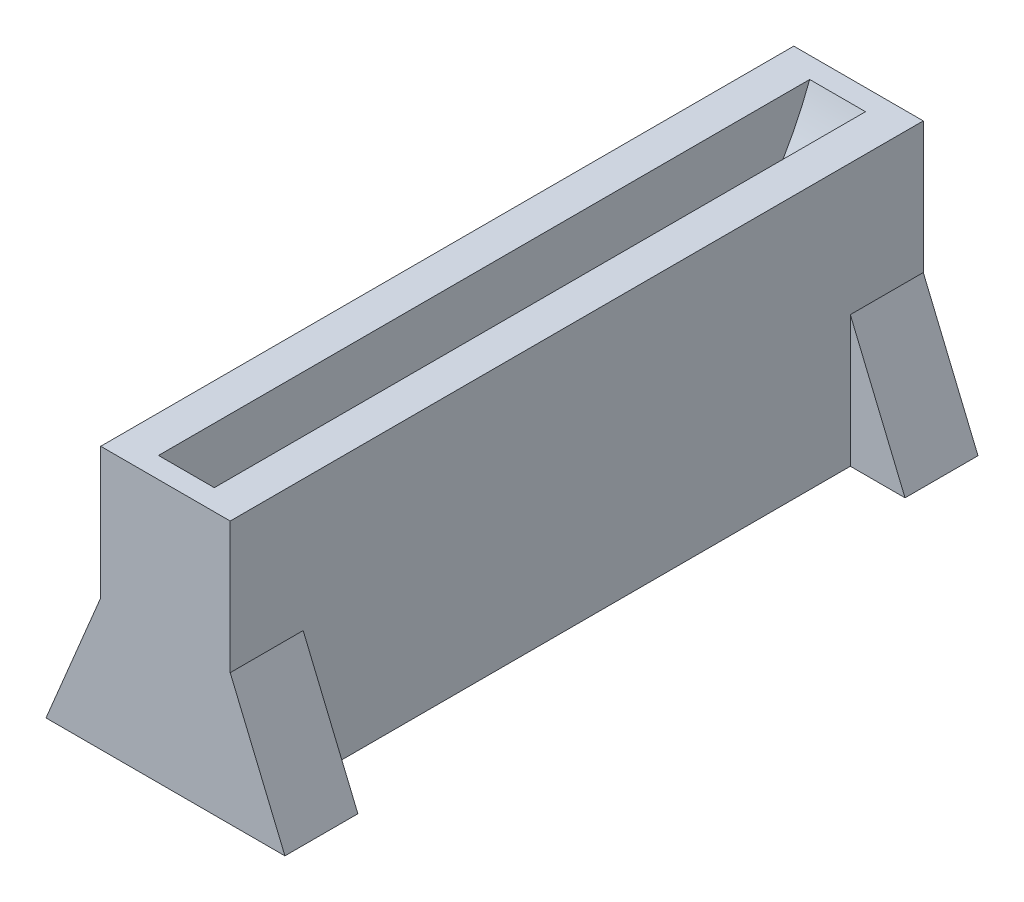
ISO-10303-21;
HEADER;
FILE_DESCRIPTION(('STEP AP214'),'2;1');
FILE_NAME('part.step','',(''),(''),'','','');
FILE_SCHEMA(('AUTOMOTIVE_DESIGN { 1 0 10303 214 1 1 1 1 }'));
ENDSEC;
DATA;
#1=APPLICATION_CONTEXT('core data for automotive mechanical design processes');
#2=APPLICATION_PROTOCOL_DEFINITION('international standard','automotive_design',2000,#1);
#3=PRODUCT_CONTEXT('',#1,'mechanical');
#4=PRODUCT('Part','Part','',(#3));
#5=PRODUCT_RELATED_PRODUCT_CATEGORY('part','',(#4));
#6=PRODUCT_DEFINITION_FORMATION('','',#4);
#7=PRODUCT_DEFINITION_CONTEXT('part definition',#1,'design');
#8=PRODUCT_DEFINITION('design','',#6,#7);
#9=PRODUCT_DEFINITION_SHAPE('','',#8);
#10=(LENGTH_UNIT() NAMED_UNIT(*) SI_UNIT(.MILLI.,.METRE.));
#11=(NAMED_UNIT(*) PLANE_ANGLE_UNIT() SI_UNIT($,.RADIAN.));
#12=(NAMED_UNIT(*) SI_UNIT($,.STERADIAN.) SOLID_ANGLE_UNIT());
#13=UNCERTAINTY_MEASURE_WITH_UNIT(LENGTH_MEASURE(1.E-05),#10,'distance_accuracy_value','');
#14=(GEOMETRIC_REPRESENTATION_CONTEXT(3) GLOBAL_UNCERTAINTY_ASSIGNED_CONTEXT((#13)) GLOBAL_UNIT_ASSIGNED_CONTEXT((#10,
#11,#12)) REPRESENTATION_CONTEXT('',''));
#15=CARTESIAN_POINT('',(0.,0.,0.));
#16=DIRECTION('',(0.,0.,1.));
#17=DIRECTION('',(1.,0.,0.));
#18=AXIS2_PLACEMENT_3D('',#15,#16,#17);
#19=CARTESIAN_POINT('',(0.,0.,0.));
#20=DIRECTION('',(0.,1.,0.));
#21=DIRECTION('',(0.,0.,1.));
#22=AXIS2_PLACEMENT_3D('',#19,#20,#21);
#23=PLANE('',#22);
#24=DIRECTION('',(-1.,0.,0.));
#25=VECTOR('',#24,1.);
#26=CARTESIAN_POINT('',(90.3346548091003,0.,-75.));
#27=LINE('',#26,#25);
#28=CARTESIAN_POINT('',(32.75,0.,-75.));
#29=VERTEX_POINT('',#28);
#30=CARTESIAN_POINT('',(17.75,0.,-75.));
#31=VERTEX_POINT('',#30);
#32=EDGE_CURVE('E144',#29,#31,#27,.T.);
#33=ORIENTED_EDGE('',*,*,#32,.T.);
#34=DIRECTION('',(0.,0.,1.));
#35=VECTOR('',#34,1.);
#36=CARTESIAN_POINT('',(17.75,0.,-75.));
#37=LINE('',#36,#35);
#38=CARTESIAN_POINT('',(17.75,0.,75.));
#39=VERTEX_POINT('',#38);
#40=EDGE_CURVE('E151',#31,#39,#37,.T.);
#41=ORIENTED_EDGE('',*,*,#40,.T.);
#42=DIRECTION('',(1.,0.,0.));
#43=VECTOR('',#42,1.);
#44=CARTESIAN_POINT('',(17.75,0.,75.));
#45=LINE('',#44,#43);
#46=CARTESIAN_POINT('',(32.75,0.,75.));
#47=VERTEX_POINT('',#46);
#48=EDGE_CURVE('E156',#39,#47,#45,.T.);
#49=ORIENTED_EDGE('',*,*,#48,.T.);
#50=DIRECTION('',(0.,0.,1.));
#51=VECTOR('',#50,1.);
#52=CARTESIAN_POINT('',(32.75,0.,-95.));
#53=LINE('',#52,#51);
#54=CARTESIAN_POINT('',(32.75,0.,95.));
#55=VERTEX_POINT('',#54);
#56=EDGE_CURVE('E192',#47,#55,#53,.T.);
#57=ORIENTED_EDGE('',*,*,#56,.T.);
#58=DIRECTION('',(1.,0.,0.));
#59=VECTOR('',#58,1.);
#60=CARTESIAN_POINT('',(-17.75,0.,95.));
#61=LINE('',#60,#59);
#62=CARTESIAN_POINT('',(-32.75,0.,95.));
#63=VERTEX_POINT('',#62);
#64=EDGE_CURVE('E230',#63,#55,#61,.T.);
#65=ORIENTED_EDGE('',*,*,#64,.F.);
#66=DIRECTION('',(0.,0.,1.));
#67=VECTOR('',#66,1.);
#68=CARTESIAN_POINT('',(-32.75,0.,-95.));
#69=LINE('',#68,#67);
#70=CARTESIAN_POINT('',(-32.75,0.,75.));
#71=VERTEX_POINT('',#70);
#72=EDGE_CURVE('E213',#71,#63,#69,.T.);
#73=ORIENTED_EDGE('',*,*,#72,.F.);
#74=DIRECTION('',(1.,0.,0.));
#75=VECTOR('',#74,1.);
#76=CARTESIAN_POINT('',(-59.1200336801783,0.,75.));
#77=LINE('',#76,#75);
#78=CARTESIAN_POINT('',(-17.75,0.,75.));
#79=VERTEX_POINT('',#78);
#80=EDGE_CURVE('E171',#71,#79,#77,.T.);
#81=ORIENTED_EDGE('',*,*,#80,.T.);
#82=DIRECTION('',(0.,0.,-1.));
#83=VECTOR('',#82,1.);
#84=CARTESIAN_POINT('',(-17.75,0.,75.));
#85=LINE('',#84,#83);
#86=CARTESIAN_POINT('',(-17.75,0.,-75.));
#87=VERTEX_POINT('',#86);
#88=EDGE_CURVE('E175',#79,#87,#85,.T.);
#89=ORIENTED_EDGE('',*,*,#88,.T.);
#90=DIRECTION('',(-1.,0.,0.));
#91=VECTOR('',#90,1.);
#92=CARTESIAN_POINT('',(-17.75,0.,-75.));
#93=LINE('',#92,#91);
#94=CARTESIAN_POINT('',(-32.75,0.,-75.));
#95=VERTEX_POINT('',#94);
#96=EDGE_CURVE('E148',#87,#95,#93,.T.);
#97=ORIENTED_EDGE('',*,*,#96,.T.);
#98=CARTESIAN_POINT('',(-32.75,0.,-95.));
#99=VERTEX_POINT('',#98);
#100=EDGE_CURVE('E208',#99,#95,#69,.T.);
#101=ORIENTED_EDGE('',*,*,#100,.F.);
#102=DIRECTION('',(-1.,0.,0.));
#103=VECTOR('',#102,1.);
#104=CARTESIAN_POINT('',(-17.75,0.,-95.));
#105=LINE('',#104,#103);
#106=CARTESIAN_POINT('',(32.75,0.,-95.));
#107=VERTEX_POINT('',#106);
#108=EDGE_CURVE('E224',#107,#99,#105,.T.);
#109=ORIENTED_EDGE('',*,*,#108,.F.);
#110=EDGE_CURVE('E160',#107,#29,#53,.T.);
#111=ORIENTED_EDGE('',*,*,#110,.T.);
#112=EDGE_LOOP('',(#33,#41,#49,#57,#65,#73,#81,#89,#97,#101,#109,#111));
#113=FACE_BOUND('',#112,.T.);
#114=ADVANCED_FACE('F39',(#113),#23,.F.);
#115=CARTESIAN_POINT('',(32.75,0.,-95.));
#116=DIRECTION('',(0.923076923076923,0.384615384615385,0.));
#117=DIRECTION('',(-0.384615384615385,0.923076923076923,0.));
#118=AXIS2_PLACEMENT_3D('',#115,#116,#117);
#119=PLANE('',#118);
#120=DIRECTION('',(0.,0.,1.));
#121=VECTOR('',#120,1.);
#122=CARTESIAN_POINT('',(17.75,36.,-95.));
#123=LINE('',#122,#121);
#124=CARTESIAN_POINT('',(17.75,36.,-95.));
#125=VERTEX_POINT('',#124);
#126=CARTESIAN_POINT('',(17.75,36.,-75.));
#127=VERTEX_POINT('',#126);
#128=EDGE_CURVE('E193',#125,#127,#123,.T.);
#129=ORIENTED_EDGE('',*,*,#128,.T.);
#130=DIRECTION('',(0.384615384615385,-0.923076923076923,0.));
#131=VECTOR('',#130,1.);
#132=CARTESIAN_POINT('',(32.75,0.,-75.));
#133=LINE('',#132,#131);
#134=EDGE_CURVE('E11',#127,#29,#133,.T.);
#135=ORIENTED_EDGE('',*,*,#134,.T.);
#136=ORIENTED_EDGE('',*,*,#110,.F.);
#137=DIRECTION('',(-0.384615384615385,0.923076923076923,0.));
#138=VECTOR('',#137,1.);
#139=CARTESIAN_POINT('',(32.75,0.,-95.));
#140=LINE('',#139,#138);
#141=EDGE_CURVE('E188',#107,#125,#140,.T.);
#142=ORIENTED_EDGE('',*,*,#141,.T.);
#143=EDGE_LOOP('',(#129,#135,#136,#142));
#144=FACE_BOUND('',#143,.T.);
#145=ADVANCED_FACE('F331',(#144),#119,.T.);
#146=ORIENTED_EDGE('',*,*,#56,.F.);
#147=DIRECTION('',(-0.384615384615385,0.923076923076923,0.));
#148=VECTOR('',#147,1.);
#149=CARTESIAN_POINT('',(32.75,0.,75.));
#150=LINE('',#149,#148);
#151=CARTESIAN_POINT('',(17.75,36.,75.));
#152=VERTEX_POINT('',#151);
#153=EDGE_CURVE('E48',#47,#152,#150,.T.);
#154=ORIENTED_EDGE('',*,*,#153,.T.);
#155=CARTESIAN_POINT('',(17.75,36.,95.));
#156=VERTEX_POINT('',#155);
#157=EDGE_CURVE('E197',#152,#156,#123,.T.);
#158=ORIENTED_EDGE('',*,*,#157,.T.);
#159=DIRECTION('',(-0.384615384615385,0.923076923076923,0.));
#160=VECTOR('',#159,1.);
#161=CARTESIAN_POINT('',(32.75,0.,95.));
#162=LINE('',#161,#160);
#163=EDGE_CURVE('E184',#55,#156,#162,.T.);
#164=ORIENTED_EDGE('',*,*,#163,.F.);
#165=EDGE_LOOP('',(#146,#154,#158,#164));
#166=FACE_BOUND('',#165,.T.);
#167=ADVANCED_FACE('F285',(#166),#119,.T.);
#168=CARTESIAN_POINT('',(-32.75,0.,-95.));
#169=DIRECTION('',(-0.923076923076923,0.384615384615385,0.));
#170=DIRECTION('',(-0.384615384615385,-0.923076923076923,0.));
#171=AXIS2_PLACEMENT_3D('',#168,#169,#170);
#172=PLANE('',#171);
#173=ORIENTED_EDGE('',*,*,#100,.T.);
#174=DIRECTION('',(0.384615384615385,0.923076923076923,0.));
#175=VECTOR('',#174,1.);
#176=CARTESIAN_POINT('',(-32.75,0.,-75.));
#177=LINE('',#176,#175);
#178=CARTESIAN_POINT('',(-17.75,36.,-75.));
#179=VERTEX_POINT('',#178);
#180=EDGE_CURVE('E279',#95,#179,#177,.T.);
#181=ORIENTED_EDGE('',*,*,#180,.T.);
#182=DIRECTION('',(0.,0.,1.));
#183=VECTOR('',#182,1.);
#184=CARTESIAN_POINT('',(-17.75,36.,-95.));
#185=LINE('',#184,#183);
#186=CARTESIAN_POINT('',(-17.75,36.,-95.));
#187=VERTEX_POINT('',#186);
#188=EDGE_CURVE('E214',#187,#179,#185,.T.);
#189=ORIENTED_EDGE('',*,*,#188,.F.);
#190=DIRECTION('',(-0.384615384615385,-0.923076923076923,0.));
#191=VECTOR('',#190,1.);
#192=CARTESIAN_POINT('',(-32.75,0.,-95.));
#193=LINE('',#192,#191);
#194=EDGE_CURVE('E203',#187,#99,#193,.T.);
#195=ORIENTED_EDGE('',*,*,#194,.T.);
#196=EDGE_LOOP('',(#173,#181,#189,#195));
#197=FACE_BOUND('',#196,.T.);
#198=ADVANCED_FACE('F314',(#197),#172,.T.);
#199=CARTESIAN_POINT('',(-17.75,36.,75.));
#200=VERTEX_POINT('',#199);
#201=CARTESIAN_POINT('',(-17.75,36.,95.));
#202=VERTEX_POINT('',#201);
#203=EDGE_CURVE('E207',#200,#202,#185,.T.);
#204=ORIENTED_EDGE('',*,*,#203,.F.);
#205=DIRECTION('',(-0.384615384615385,-0.923076923076923,0.));
#206=VECTOR('',#205,1.);
#207=CARTESIAN_POINT('',(-32.75,0.,75.));
#208=LINE('',#207,#206);
#209=EDGE_CURVE('E275',#200,#71,#208,.T.);
#210=ORIENTED_EDGE('',*,*,#209,.T.);
#211=ORIENTED_EDGE('',*,*,#72,.T.);
#212=DIRECTION('',(-0.384615384615385,-0.923076923076923,0.));
#213=VECTOR('',#212,1.);
#214=CARTESIAN_POINT('',(-32.75,0.,95.));
#215=LINE('',#214,#213);
#216=EDGE_CURVE('E196',#202,#63,#215,.T.);
#217=ORIENTED_EDGE('',*,*,#216,.F.);
#218=EDGE_LOOP('',(#204,#210,#211,#217));
#219=FACE_BOUND('',#218,.T.);
#220=ADVANCED_FACE('F300',(#219),#172,.T.);
#221=CARTESIAN_POINT('',(17.75,72.,-95.));
#222=DIRECTION('',(-1.,0.,0.));
#223=DIRECTION('',(0.,0.,1.));
#224=AXIS2_PLACEMENT_3D('',#221,#222,#223);
#225=PLANE('',#224);
#226=ORIENTED_EDGE('',*,*,#157,.F.);
#227=DIRECTION('',(0.,-1.,0.));
#228=VECTOR('',#227,1.);
#229=CARTESIAN_POINT('',(17.75,45.,75.));
#230=LINE('',#229,#228);
#231=EDGE_CURVE('E55',#152,#39,#230,.T.);
#232=ORIENTED_EDGE('',*,*,#231,.T.);
#233=ORIENTED_EDGE('',*,*,#40,.F.);
#234=DIRECTION('',(0.,-1.,0.));
#235=VECTOR('',#234,1.);
#236=CARTESIAN_POINT('',(17.75,45.,-75.));
#237=LINE('',#236,#235);
#238=EDGE_CURVE('E140',#127,#31,#237,.T.);
#239=ORIENTED_EDGE('',*,*,#238,.F.);
#240=ORIENTED_EDGE('',*,*,#128,.F.);
#241=DIRECTION('',(0.,-1.,0.));
#242=VECTOR('',#241,1.);
#243=CARTESIAN_POINT('',(17.75,72.,-95.));
#244=LINE('',#243,#242);
#245=CARTESIAN_POINT('',(17.75,72.,-95.));
#246=VERTEX_POINT('',#245);
#247=EDGE_CURVE('E256',#246,#125,#244,.T.);
#248=ORIENTED_EDGE('',*,*,#247,.F.);
#249=DIRECTION('',(0.,0.,-1.));
#250=VECTOR('',#249,1.);
#251=CARTESIAN_POINT('',(17.75,72.,-95.));
#252=LINE('',#251,#250);
#253=CARTESIAN_POINT('',(17.75,72.,95.));
#254=VERTEX_POINT('',#253);
#255=EDGE_CURVE('E225',#254,#246,#252,.T.);
#256=ORIENTED_EDGE('',*,*,#255,.F.);
#257=DIRECTION('',(0.,-1.,0.));
#258=VECTOR('',#257,1.);
#259=CARTESIAN_POINT('',(17.75,72.,95.));
#260=LINE('',#259,#258);
#261=EDGE_CURVE('E239',#254,#156,#260,.T.);
#262=ORIENTED_EDGE('',*,*,#261,.T.);
#263=EDGE_LOOP('',(#226,#232,#233,#239,#240,#248,#256,#262));
#264=FACE_BOUND('',#263,.T.);
#265=ADVANCED_FACE('F41',(#264),#225,.F.);
#266=CARTESIAN_POINT('',(-17.75,72.,-95.));
#267=DIRECTION('',(0.,0.,1.));
#268=DIRECTION('',(1.,0.,0.));
#269=AXIS2_PLACEMENT_3D('',#266,#267,#268);
#270=PLANE('',#269);
#271=ORIENTED_EDGE('',*,*,#108,.T.);
#272=ORIENTED_EDGE('',*,*,#194,.F.);
#273=DIRECTION('',(0.,-1.,0.));
#274=VECTOR('',#273,1.);
#275=CARTESIAN_POINT('',(-17.75,72.,-95.));
#276=LINE('',#275,#274);
#277=CARTESIAN_POINT('',(-17.75,72.,-95.));
#278=VERTEX_POINT('',#277);
#279=EDGE_CURVE('E252',#278,#187,#276,.T.);
#280=ORIENTED_EDGE('',*,*,#279,.F.);
#281=DIRECTION('',(-1.,0.,0.));
#282=VECTOR('',#281,1.);
#283=CARTESIAN_POINT('',(-17.75,72.,-95.));
#284=LINE('',#283,#282);
#285=EDGE_CURVE('E229',#246,#278,#284,.T.);
#286=ORIENTED_EDGE('',*,*,#285,.F.);
#287=ORIENTED_EDGE('',*,*,#247,.T.);
#288=ORIENTED_EDGE('',*,*,#141,.F.);
#289=EDGE_LOOP('',(#271,#272,#280,#286,#287,#288));
#290=FACE_BOUND('',#289,.T.);
#291=ADVANCED_FACE('F311',(#290),#270,.F.);
#292=CARTESIAN_POINT('',(-17.75,72.,-95.));
#293=DIRECTION('',(1.,0.,0.));
#294=DIRECTION('',(0.,0.,-1.));
#295=AXIS2_PLACEMENT_3D('',#292,#293,#294);
#296=PLANE('',#295);
#297=ORIENTED_EDGE('',*,*,#188,.T.);
#298=DIRECTION('',(0.,-1.,0.));
#299=VECTOR('',#298,1.);
#300=CARTESIAN_POINT('',(-17.75,45.,-75.));
#301=LINE('',#300,#299);
#302=EDGE_CURVE('E179',#179,#87,#301,.T.);
#303=ORIENTED_EDGE('',*,*,#302,.T.);
#304=ORIENTED_EDGE('',*,*,#88,.F.);
#305=DIRECTION('',(0.,-1.,0.));
#306=VECTOR('',#305,1.);
#307=CARTESIAN_POINT('',(-17.75,45.,75.));
#308=LINE('',#307,#306);
#309=EDGE_CURVE('E63',#200,#79,#308,.T.);
#310=ORIENTED_EDGE('',*,*,#309,.F.);
#311=ORIENTED_EDGE('',*,*,#203,.T.);
#312=DIRECTION('',(0.,-1.,0.));
#313=VECTOR('',#312,1.);
#314=CARTESIAN_POINT('',(-17.75,72.,95.));
#315=LINE('',#314,#313);
#316=CARTESIAN_POINT('',(-17.75,72.,95.));
#317=VERTEX_POINT('',#316);
#318=EDGE_CURVE('E248',#317,#202,#315,.T.);
#319=ORIENTED_EDGE('',*,*,#318,.F.);
#320=DIRECTION('',(0.,0.,1.));
#321=VECTOR('',#320,1.);
#322=CARTESIAN_POINT('',(-17.75,72.,-95.));
#323=LINE('',#322,#321);
#324=EDGE_CURVE('E233',#278,#317,#323,.T.);
#325=ORIENTED_EDGE('',*,*,#324,.F.);
#326=ORIENTED_EDGE('',*,*,#279,.T.);
#327=EDGE_LOOP('',(#297,#303,#304,#310,#311,#319,#325,#326));
#328=FACE_BOUND('',#327,.T.);
#329=ADVANCED_FACE('F303',(#328),#296,.F.);
#330=CARTESIAN_POINT('',(-17.75,72.,95.));
#331=DIRECTION('',(0.,0.,-1.));
#332=DIRECTION('',(-1.,0.,0.));
#333=AXIS2_PLACEMENT_3D('',#330,#331,#332);
#334=PLANE('',#333);
#335=ORIENTED_EDGE('',*,*,#64,.T.);
#336=ORIENTED_EDGE('',*,*,#163,.T.);
#337=ORIENTED_EDGE('',*,*,#261,.F.);
#338=DIRECTION('',(1.,0.,0.));
#339=VECTOR('',#338,1.);
#340=CARTESIAN_POINT('',(-17.75,72.,95.));
#341=LINE('',#340,#339);
#342=EDGE_CURVE('E236',#317,#254,#341,.T.);
#343=ORIENTED_EDGE('',*,*,#342,.F.);
#344=ORIENTED_EDGE('',*,*,#318,.T.);
#345=ORIENTED_EDGE('',*,*,#216,.T.);
#346=EDGE_LOOP('',(#335,#336,#337,#343,#344,#345));
#347=FACE_BOUND('',#346,.T.);
#348=ADVANCED_FACE('F294',(#347),#334,.F.);
#349=CARTESIAN_POINT('',(0.,72.,0.));
#350=DIRECTION('',(0.,1.,0.));
#351=DIRECTION('',(0.,0.,1.));
#352=AXIS2_PLACEMENT_3D('',#349,#350,#351);
#353=PLANE('',#352);
#354=DIRECTION('',(0.,0.,-1.));
#355=VECTOR('',#354,1.);
#356=CARTESIAN_POINT('',(7.65,72.,0.));
#357=LINE('',#356,#355);
#358=CARTESIAN_POINT('',(7.65,72.,89.2580528579915));
#359=VERTEX_POINT('',#358);
#360=CARTESIAN_POINT('',(7.65,72.,-89.2580528579915));
#361=VERTEX_POINT('',#360);
#362=EDGE_CURVE('E272',#359,#361,#357,.T.);
#363=ORIENTED_EDGE('',*,*,#362,.F.);
#364=DIRECTION('',(-1.,0.,0.));
#365=VECTOR('',#364,1.);
#366=CARTESIAN_POINT('',(7.65,72.,89.2580528579915));
#367=LINE('',#366,#365);
#368=CARTESIAN_POINT('',(-7.65,72.,89.2580528579915));
#369=VERTEX_POINT('',#368);
#370=EDGE_CURVE('E264',#359,#369,#367,.T.);
#371=ORIENTED_EDGE('',*,*,#370,.T.);
#372=DIRECTION('',(0.,0.,-1.));
#373=VECTOR('',#372,1.);
#374=CARTESIAN_POINT('',(-7.65,72.,0.));
#375=LINE('',#374,#373);
#376=CARTESIAN_POINT('',(-7.65,72.,-89.2580528579915));
#377=VERTEX_POINT('',#376);
#378=EDGE_CURVE('E260',#369,#377,#375,.T.);
#379=ORIENTED_EDGE('',*,*,#378,.T.);
#380=DIRECTION('',(-1.,0.,0.));
#381=VECTOR('',#380,1.);
#382=CARTESIAN_POINT('',(7.65,72.,-89.2580528579915));
#383=LINE('',#382,#381);
#384=EDGE_CURVE('E268',#377,#361,#383,.F.);
#385=ORIENTED_EDGE('',*,*,#384,.T.);
#386=EDGE_LOOP('',(#363,#371,#379,#385));
#387=FACE_BOUND('',#386,.T.);
#388=ORIENTED_EDGE('',*,*,#255,.T.);
#389=ORIENTED_EDGE('',*,*,#285,.T.);
#390=ORIENTED_EDGE('',*,*,#324,.T.);
#391=ORIENTED_EDGE('',*,*,#342,.T.);
#392=EDGE_LOOP('',(#388,#389,#390,#391));
#393=FACE_BOUND('',#392,.T.);
#394=ADVANCED_FACE('F306',(#387,#393),#353,.T.);
#395=CARTESIAN_POINT('',(7.65,105.25,0.));
#396=DIRECTION('',(-1.,0.,0.));
#397=DIRECTION('',(0.,0.,1.));
#398=AXIS2_PLACEMENT_3D('',#395,#396,#397);
#399=CYLINDRICAL_SURFACE('',#398,95.25);
#400=CARTESIAN_POINT('',(-7.65,105.25,0.));
#401=DIRECTION('',(1.,0.,0.));
#402=DIRECTION('',(0.,0.,-1.));
#403=AXIS2_PLACEMENT_3D('',#400,#401,#402);
#404=CIRCLE('',#403,95.25);
#405=EDGE_CURVE('E212',#369,#377,#404,.T.);
#406=ORIENTED_EDGE('',*,*,#405,.F.);
#407=ORIENTED_EDGE('',*,*,#370,.F.);
#408=CARTESIAN_POINT('',(7.65,105.25,0.));
#409=DIRECTION('',(1.,0.,0.));
#410=DIRECTION('',(0.,0.,-1.));
#411=AXIS2_PLACEMENT_3D('',#408,#409,#410);
#412=CIRCLE('',#411,95.25);
#413=EDGE_CURVE('E220',#359,#361,#412,.T.);
#414=ORIENTED_EDGE('',*,*,#413,.T.);
#415=ORIENTED_EDGE('',*,*,#384,.F.);
#416=EDGE_LOOP('',(#406,#407,#414,#415));
#417=FACE_BOUND('',#416,.T.);
#418=ADVANCED_FACE('F361',(#417),#399,.F.);
#419=CARTESIAN_POINT('',(7.65,105.25,0.));
#420=DIRECTION('',(1.,0.,0.));
#421=DIRECTION('',(0.,0.,-1.));
#422=AXIS2_PLACEMENT_3D('',#419,#420,#421);
#423=PLANE('',#422);
#424=ORIENTED_EDGE('',*,*,#362,.T.);
#425=ORIENTED_EDGE('',*,*,#413,.F.);
#426=EDGE_LOOP('',(#424,#425));
#427=FACE_BOUND('',#426,.T.);
#428=ADVANCED_FACE('F358',(#427),#423,.F.);
#429=CARTESIAN_POINT('',(-7.65,105.25,0.));
#430=DIRECTION('',(1.,0.,0.));
#431=DIRECTION('',(0.,0.,-1.));
#432=AXIS2_PLACEMENT_3D('',#429,#430,#431);
#433=PLANE('',#432);
#434=ORIENTED_EDGE('',*,*,#405,.T.);
#435=ORIENTED_EDGE('',*,*,#378,.F.);
#436=EDGE_LOOP('',(#434,#435));
#437=FACE_BOUND('',#436,.T.);
#438=ADVANCED_FACE('F328',(#437),#433,.T.);
#439=CARTESIAN_POINT('',(-17.75,45.,-75.));
#440=DIRECTION('',(0.,0.,1.));
#441=DIRECTION('',(1.,0.,0.));
#442=AXIS2_PLACEMENT_3D('',#439,#440,#441);
#443=PLANE('',#442);
#444=ORIENTED_EDGE('',*,*,#96,.F.);
#445=ORIENTED_EDGE('',*,*,#302,.F.);
#446=ORIENTED_EDGE('',*,*,#180,.F.);
#447=EDGE_LOOP('',(#444,#445,#446));
#448=FACE_BOUND('',#447,.T.);
#449=ADVANCED_FACE('F317',(#448),#443,.T.);
#450=CARTESIAN_POINT('',(-59.1200336801783,45.,75.));
#451=DIRECTION('',(0.,0.,-1.));
#452=DIRECTION('',(-1.,0.,0.));
#453=AXIS2_PLACEMENT_3D('',#450,#451,#452);
#454=PLANE('',#453);
#455=ORIENTED_EDGE('',*,*,#309,.T.);
#456=ORIENTED_EDGE('',*,*,#80,.F.);
#457=ORIENTED_EDGE('',*,*,#209,.F.);
#458=EDGE_LOOP('',(#455,#456,#457));
#459=FACE_BOUND('',#458,.T.);
#460=ADVANCED_FACE('F319',(#459),#454,.T.);
#461=CARTESIAN_POINT('',(90.3346548091003,45.,-75.));
#462=DIRECTION('',(0.,0.,1.));
#463=DIRECTION('',(1.,0.,0.));
#464=AXIS2_PLACEMENT_3D('',#461,#462,#463);
#465=PLANE('',#464);
#466=ORIENTED_EDGE('',*,*,#238,.T.);
#467=ORIENTED_EDGE('',*,*,#32,.F.);
#468=ORIENTED_EDGE('',*,*,#134,.F.);
#469=EDGE_LOOP('',(#466,#467,#468));
#470=FACE_BOUND('',#469,.T.);
#471=ADVANCED_FACE('F142',(#470),#465,.T.);
#472=CARTESIAN_POINT('',(17.75,45.,75.));
#473=DIRECTION('',(0.,0.,-1.));
#474=DIRECTION('',(-1.,0.,0.));
#475=AXIS2_PLACEMENT_3D('',#472,#473,#474);
#476=PLANE('',#475);
#477=ORIENTED_EDGE('',*,*,#48,.F.);
#478=ORIENTED_EDGE('',*,*,#231,.F.);
#479=ORIENTED_EDGE('',*,*,#153,.F.);
#480=EDGE_LOOP('',(#477,#478,#479));
#481=FACE_BOUND('',#480,.T.);
#482=ADVANCED_FACE('F326',(#481),#476,.T.);
#483=CLOSED_SHELL('',(#114,#145,#167,#198,#220,#265,#291,#329,#348,#394,#418,#428,#438,#449,
#460,#471,#482));
#484=MANIFOLD_SOLID_BREP('B2',#483);
#485=ADVANCED_BREP_SHAPE_REPRESENTATION('',(#18,#484),#14);
#486=SHAPE_DEFINITION_REPRESENTATION(#9,#485);
ENDSEC;
END-ISO-10303-21;
